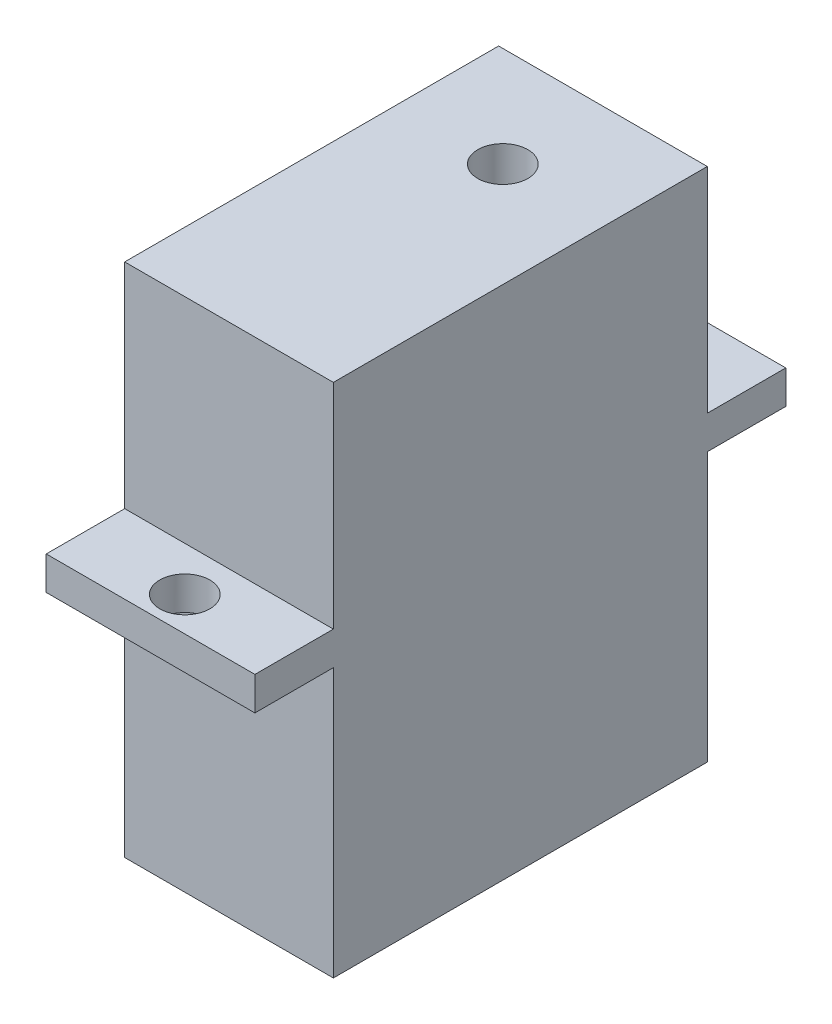
ISO-10303-21;
HEADER;
FILE_DESCRIPTION(('STEP AP214'),'2;1');
FILE_NAME('part.step','',(''),(''),'','','');
FILE_SCHEMA(('AUTOMOTIVE_DESIGN { 1 0 10303 214 1 1 1 1 }'));
ENDSEC;
DATA;
#1=APPLICATION_CONTEXT('core data for automotive mechanical design processes');
#2=APPLICATION_PROTOCOL_DEFINITION('international standard','automotive_design',2000,#1);
#3=PRODUCT_CONTEXT('',#1,'mechanical');
#4=PRODUCT('Part','Part','',(#3));
#5=PRODUCT_RELATED_PRODUCT_CATEGORY('part','',(#4));
#6=PRODUCT_DEFINITION_FORMATION('','',#4);
#7=PRODUCT_DEFINITION_CONTEXT('part definition',#1,'design');
#8=PRODUCT_DEFINITION('design','',#6,#7);
#9=PRODUCT_DEFINITION_SHAPE('','',#8);
#10=(LENGTH_UNIT() NAMED_UNIT(*) SI_UNIT(.MILLI.,.METRE.));
#11=(NAMED_UNIT(*) PLANE_ANGLE_UNIT() SI_UNIT($,.RADIAN.));
#12=(NAMED_UNIT(*) SI_UNIT($,.STERADIAN.) SOLID_ANGLE_UNIT());
#13=UNCERTAINTY_MEASURE_WITH_UNIT(LENGTH_MEASURE(1.E-05),#10,'distance_accuracy_value','');
#14=(GEOMETRIC_REPRESENTATION_CONTEXT(3) GLOBAL_UNCERTAINTY_ASSIGNED_CONTEXT((#13)) GLOBAL_UNIT_ASSIGNED_CONTEXT((#10,
#11,#12)) REPRESENTATION_CONTEXT('',''));
#15=CARTESIAN_POINT('',(0.,0.,0.));
#16=DIRECTION('',(0.,0.,1.));
#17=DIRECTION('',(1.,0.,0.));
#18=AXIS2_PLACEMENT_3D('',#15,#16,#17);
#19=CARTESIAN_POINT('',(-6.25,30.9,-11.2));
#20=DIRECTION('',(0.,0.,1.));
#21=DIRECTION('',(1.,0.,0.));
#22=AXIS2_PLACEMENT_3D('',#19,#20,#21);
#23=PLANE('',#22);
#24=DIRECTION('',(0.,-1.,0.));
#25=VECTOR('',#24,1.);
#26=CARTESIAN_POINT('',(6.25,30.9,-11.2));
#27=LINE('',#26,#25);
#28=CARTESIAN_POINT('',(6.25,30.9,-11.2));
#29=VERTEX_POINT('',#28);
#30=CARTESIAN_POINT('',(6.25,18.1,-11.2));
#31=VERTEX_POINT('',#30);
#32=EDGE_CURVE('E51',#29,#31,#27,.T.);
#33=ORIENTED_EDGE('',*,*,#32,.T.);
#34=DIRECTION('',(-1.,0.,0.));
#35=VECTOR('',#34,1.);
#36=CARTESIAN_POINT('',(-6.25,18.1,-11.2));
#37=LINE('',#36,#35);
#38=CARTESIAN_POINT('',(-6.25,18.1,-11.2));
#39=VERTEX_POINT('',#38);
#40=EDGE_CURVE('E182',#31,#39,#37,.T.);
#41=ORIENTED_EDGE('',*,*,#40,.T.);
#42=DIRECTION('',(0.,-1.,0.));
#43=VECTOR('',#42,1.);
#44=CARTESIAN_POINT('',(-6.25,30.9,-11.2));
#45=LINE('',#44,#43);
#46=CARTESIAN_POINT('',(-6.25,30.9,-11.2));
#47=VERTEX_POINT('',#46);
#48=EDGE_CURVE('E210',#47,#39,#45,.T.);
#49=ORIENTED_EDGE('',*,*,#48,.F.);
#50=DIRECTION('',(-1.,0.,0.));
#51=VECTOR('',#50,1.);
#52=CARTESIAN_POINT('',(-6.25,30.9,-11.2));
#53=LINE('',#52,#51);
#54=EDGE_CURVE('E188',#29,#47,#53,.T.);
#55=ORIENTED_EDGE('',*,*,#54,.F.);
#56=EDGE_LOOP('',(#33,#41,#49,#55));
#57=FACE_BOUND('',#56,.T.);
#58=ADVANCED_FACE('F35',(#57),#23,.F.);
#59=CARTESIAN_POINT('',(-6.25,30.9,11.2));
#60=DIRECTION('',(0.,0.,-1.));
#61=DIRECTION('',(-1.,0.,0.));
#62=AXIS2_PLACEMENT_3D('',#59,#60,#61);
#63=PLANE('',#62);
#64=DIRECTION('',(0.,-1.,0.));
#65=VECTOR('',#64,1.);
#66=CARTESIAN_POINT('',(-6.25,30.9,11.2));
#67=LINE('',#66,#65);
#68=CARTESIAN_POINT('',(-6.25,30.9,11.2));
#69=VERTEX_POINT('',#68);
#70=CARTESIAN_POINT('',(-6.25,18.1,11.2));
#71=VERTEX_POINT('',#70);
#72=EDGE_CURVE('E207',#69,#71,#67,.T.);
#73=ORIENTED_EDGE('',*,*,#72,.T.);
#74=DIRECTION('',(1.,0.,0.));
#75=VECTOR('',#74,1.);
#76=CARTESIAN_POINT('',(-6.25,18.1,11.2));
#77=LINE('',#76,#75);
#78=CARTESIAN_POINT('',(6.25,18.1,11.2));
#79=VERTEX_POINT('',#78);
#80=EDGE_CURVE('E11',#71,#79,#77,.T.);
#81=ORIENTED_EDGE('',*,*,#80,.T.);
#82=DIRECTION('',(0.,-1.,0.));
#83=VECTOR('',#82,1.);
#84=CARTESIAN_POINT('',(6.25,30.9,11.2));
#85=LINE('',#84,#83);
#86=CARTESIAN_POINT('',(6.25,30.9,11.2));
#87=VERTEX_POINT('',#86);
#88=EDGE_CURVE('E204',#87,#79,#85,.T.);
#89=ORIENTED_EDGE('',*,*,#88,.F.);
#90=DIRECTION('',(1.,0.,0.));
#91=VECTOR('',#90,1.);
#92=CARTESIAN_POINT('',(-6.25,30.9,11.2));
#93=LINE('',#92,#91);
#94=EDGE_CURVE('E193',#69,#87,#93,.T.);
#95=ORIENTED_EDGE('',*,*,#94,.F.);
#96=EDGE_LOOP('',(#73,#81,#89,#95));
#97=FACE_BOUND('',#96,.T.);
#98=ADVANCED_FACE('F229',(#97),#63,.F.);
#99=CARTESIAN_POINT('',(6.25,30.9,-11.2));
#100=DIRECTION('',(-1.,0.,0.));
#101=DIRECTION('',(0.,0.,1.));
#102=AXIS2_PLACEMENT_3D('',#99,#100,#101);
#103=PLANE('',#102);
#104=CARTESIAN_POINT('',(6.25,16.1,-11.2));
#105=VERTEX_POINT('',#104);
#106=CARTESIAN_POINT('',(6.25,0.,-11.2));
#107=VERTEX_POINT('',#106);
#108=EDGE_CURVE('E213',#105,#107,#27,.T.);
#109=ORIENTED_EDGE('',*,*,#108,.F.);
#110=DIRECTION('',(0.,0.,-1.));
#111=VECTOR('',#110,1.);
#112=CARTESIAN_POINT('',(6.25,16.1,15.9));
#113=LINE('',#112,#111);
#114=CARTESIAN_POINT('',(6.25,16.1,-15.9));
#115=VERTEX_POINT('',#114);
#116=EDGE_CURVE('E170',#105,#115,#113,.T.);
#117=ORIENTED_EDGE('',*,*,#116,.T.);
#118=DIRECTION('',(0.,1.,0.));
#119=VECTOR('',#118,1.);
#120=CARTESIAN_POINT('',(6.25,16.1,-15.9));
#121=LINE('',#120,#119);
#122=CARTESIAN_POINT('',(6.25,18.1,-15.9));
#123=VERTEX_POINT('',#122);
#124=EDGE_CURVE('E172',#115,#123,#121,.T.);
#125=ORIENTED_EDGE('',*,*,#124,.T.);
#126=DIRECTION('',(0.,0.,1.));
#127=VECTOR('',#126,1.);
#128=CARTESIAN_POINT('',(6.25,18.1,15.9));
#129=LINE('',#128,#127);
#130=EDGE_CURVE('E154',#123,#31,#129,.T.);
#131=ORIENTED_EDGE('',*,*,#130,.T.);
#132=ORIENTED_EDGE('',*,*,#32,.F.);
#133=DIRECTION('',(0.,0.,-1.));
#134=VECTOR('',#133,1.);
#135=CARTESIAN_POINT('',(6.25,30.9,-11.2));
#136=LINE('',#135,#134);
#137=EDGE_CURVE('E185',#87,#29,#136,.T.);
#138=ORIENTED_EDGE('',*,*,#137,.F.);
#139=ORIENTED_EDGE('',*,*,#88,.T.);
#140=CARTESIAN_POINT('',(6.25,18.1,15.9));
#141=VERTEX_POINT('',#140);
#142=EDGE_CURVE('E157',#79,#141,#129,.T.);
#143=ORIENTED_EDGE('',*,*,#142,.T.);
#144=DIRECTION('',(0.,-1.,0.));
#145=VECTOR('',#144,1.);
#146=CARTESIAN_POINT('',(6.25,16.1,15.9));
#147=LINE('',#146,#145);
#148=CARTESIAN_POINT('',(6.25,16.1,15.9));
#149=VERTEX_POINT('',#148);
#150=EDGE_CURVE('E168',#141,#149,#147,.T.);
#151=ORIENTED_EDGE('',*,*,#150,.T.);
#152=CARTESIAN_POINT('',(6.25,16.1,11.2));
#153=VERTEX_POINT('',#152);
#154=EDGE_CURVE('E131',#149,#153,#113,.T.);
#155=ORIENTED_EDGE('',*,*,#154,.T.);
#156=CARTESIAN_POINT('',(6.25,0.,11.2));
#157=VERTEX_POINT('',#156);
#158=EDGE_CURVE('E195',#153,#157,#85,.T.);
#159=ORIENTED_EDGE('',*,*,#158,.T.);
#160=DIRECTION('',(0.,0.,-1.));
#161=VECTOR('',#160,1.);
#162=CARTESIAN_POINT('',(6.25,0.,-11.2));
#163=LINE('',#162,#161);
#164=EDGE_CURVE('E184',#157,#107,#163,.T.);
#165=ORIENTED_EDGE('',*,*,#164,.T.);
#166=EDGE_LOOP('',(#109,#117,#125,#131,#132,#138,#139,#143,#151,#155,#159,#165));
#167=FACE_BOUND('',#166,.T.);
#168=ADVANCED_FACE('F37',(#167),#103,.F.);
#169=CARTESIAN_POINT('',(-6.25,16.1,-11.2));
#170=VERTEX_POINT('',#169);
#171=CARTESIAN_POINT('',(-6.25,0.,-11.2));
#172=VERTEX_POINT('',#171);
#173=EDGE_CURVE('E59',#170,#172,#45,.T.);
#174=ORIENTED_EDGE('',*,*,#173,.F.);
#175=DIRECTION('',(1.,0.,0.));
#176=VECTOR('',#175,1.);
#177=CARTESIAN_POINT('',(-6.25,16.1,-11.2));
#178=LINE('',#177,#176);
#179=EDGE_CURVE('E176',#170,#105,#178,.T.);
#180=ORIENTED_EDGE('',*,*,#179,.T.);
#181=ORIENTED_EDGE('',*,*,#108,.T.);
#182=DIRECTION('',(-1.,0.,0.));
#183=VECTOR('',#182,1.);
#184=CARTESIAN_POINT('',(-6.25,0.,-11.2));
#185=LINE('',#184,#183);
#186=EDGE_CURVE('E198',#107,#172,#185,.T.);
#187=ORIENTED_EDGE('',*,*,#186,.T.);
#188=EDGE_LOOP('',(#174,#180,#181,#187));
#189=FACE_BOUND('',#188,.T.);
#190=ADVANCED_FACE('F246',(#189),#23,.F.);
#191=CARTESIAN_POINT('',(-6.25,30.9,-11.2));
#192=DIRECTION('',(1.,0.,0.));
#193=DIRECTION('',(0.,0.,-1.));
#194=AXIS2_PLACEMENT_3D('',#191,#192,#193);
#195=PLANE('',#194);
#196=CARTESIAN_POINT('',(-6.25,16.1,11.2));
#197=VERTEX_POINT('',#196);
#198=CARTESIAN_POINT('',(-6.25,0.,11.2));
#199=VERTEX_POINT('',#198);
#200=EDGE_CURVE('E146',#197,#199,#67,.T.);
#201=ORIENTED_EDGE('',*,*,#200,.F.);
#202=DIRECTION('',(0.,0.,-1.));
#203=VECTOR('',#202,1.);
#204=CARTESIAN_POINT('',(-6.25,16.1,15.9));
#205=LINE('',#204,#203);
#206=CARTESIAN_POINT('',(-6.25,16.1,15.9));
#207=VERTEX_POINT('',#206);
#208=EDGE_CURVE('E129',#207,#197,#205,.T.);
#209=ORIENTED_EDGE('',*,*,#208,.F.);
#210=DIRECTION('',(0.,-1.,0.));
#211=VECTOR('',#210,1.);
#212=CARTESIAN_POINT('',(-6.25,16.1,15.9));
#213=LINE('',#212,#211);
#214=CARTESIAN_POINT('',(-6.25,18.1,15.9));
#215=VERTEX_POINT('',#214);
#216=EDGE_CURVE('E144',#215,#207,#213,.T.);
#217=ORIENTED_EDGE('',*,*,#216,.F.);
#218=DIRECTION('',(0.,0.,1.));
#219=VECTOR('',#218,1.);
#220=CARTESIAN_POINT('',(-6.25,18.1,15.9));
#221=LINE('',#220,#219);
#222=EDGE_CURVE('E165',#71,#215,#221,.T.);
#223=ORIENTED_EDGE('',*,*,#222,.F.);
#224=ORIENTED_EDGE('',*,*,#72,.F.);
#225=DIRECTION('',(0.,0.,1.));
#226=VECTOR('',#225,1.);
#227=CARTESIAN_POINT('',(-6.25,30.9,-11.2));
#228=LINE('',#227,#226);
#229=EDGE_CURVE('E191',#47,#69,#228,.T.);
#230=ORIENTED_EDGE('',*,*,#229,.F.);
#231=ORIENTED_EDGE('',*,*,#48,.T.);
#232=CARTESIAN_POINT('',(-6.25,18.1,-15.9));
#233=VERTEX_POINT('',#232);
#234=EDGE_CURVE('E137',#233,#39,#221,.T.);
#235=ORIENTED_EDGE('',*,*,#234,.F.);
#236=DIRECTION('',(0.,1.,0.));
#237=VECTOR('',#236,1.);
#238=CARTESIAN_POINT('',(-6.25,16.1,-15.9));
#239=LINE('',#238,#237);
#240=CARTESIAN_POINT('',(-6.25,16.1,-15.9));
#241=VERTEX_POINT('',#240);
#242=EDGE_CURVE('E147',#241,#233,#239,.T.);
#243=ORIENTED_EDGE('',*,*,#242,.F.);
#244=EDGE_CURVE('E148',#170,#241,#205,.T.);
#245=ORIENTED_EDGE('',*,*,#244,.F.);
#246=ORIENTED_EDGE('',*,*,#173,.T.);
#247=DIRECTION('',(0.,0.,1.));
#248=VECTOR('',#247,1.);
#249=CARTESIAN_POINT('',(-6.25,0.,-11.2));
#250=LINE('',#249,#248);
#251=EDGE_CURVE('E200',#172,#199,#250,.T.);
#252=ORIENTED_EDGE('',*,*,#251,.T.);
#253=EDGE_LOOP('',(#201,#209,#217,#223,#224,#230,#231,#235,#243,#245,#246,#252));
#254=FACE_BOUND('',#253,.T.);
#255=ADVANCED_FACE('F142',(#254),#195,.F.);
#256=ORIENTED_EDGE('',*,*,#158,.F.);
#257=DIRECTION('',(-1.,0.,0.));
#258=VECTOR('',#257,1.);
#259=CARTESIAN_POINT('',(-6.25,16.1,11.2));
#260=LINE('',#259,#258);
#261=EDGE_CURVE('E44',#153,#197,#260,.T.);
#262=ORIENTED_EDGE('',*,*,#261,.T.);
#263=ORIENTED_EDGE('',*,*,#200,.T.);
#264=DIRECTION('',(1.,0.,0.));
#265=VECTOR('',#264,1.);
#266=CARTESIAN_POINT('',(-6.25,0.,11.2));
#267=LINE('',#266,#265);
#268=EDGE_CURVE('E189',#199,#157,#267,.T.);
#269=ORIENTED_EDGE('',*,*,#268,.T.);
#270=EDGE_LOOP('',(#256,#262,#263,#269));
#271=FACE_BOUND('',#270,.T.);
#272=ADVANCED_FACE('F217',(#271),#63,.F.);
#273=CARTESIAN_POINT('',(0.,30.9,0.));
#274=DIRECTION('',(0.,1.,0.));
#275=DIRECTION('',(0.,0.,1.));
#276=AXIS2_PLACEMENT_3D('',#273,#274,#275);
#277=PLANE('',#276);
#278=CARTESIAN_POINT('',(0.,30.9,-5.2));
#279=DIRECTION('',(0.,1.,0.));
#280=DIRECTION('',(0.,0.,1.));
#281=AXIS2_PLACEMENT_3D('',#278,#279,#280);
#282=CIRCLE('',#281,1.5);
#283=CARTESIAN_POINT('',(0.,30.9,-3.7));
#284=VERTEX_POINT('',#283);
#285=EDGE_CURVE('E412',#284,#284,#282,.T.);
#286=ORIENTED_EDGE('',*,*,#285,.F.);
#287=EDGE_LOOP('',(#286));
#288=FACE_BOUND('',#287,.T.);
#289=ORIENTED_EDGE('',*,*,#137,.T.);
#290=ORIENTED_EDGE('',*,*,#54,.T.);
#291=ORIENTED_EDGE('',*,*,#229,.T.);
#292=ORIENTED_EDGE('',*,*,#94,.T.);
#293=EDGE_LOOP('',(#289,#290,#291,#292));
#294=FACE_BOUND('',#293,.T.);
#295=ADVANCED_FACE('F231',(#288,#294),#277,.T.);
#296=CARTESIAN_POINT('',(0.,0.,0.));
#297=DIRECTION('',(0.,1.,0.));
#298=DIRECTION('',(0.,0.,1.));
#299=AXIS2_PLACEMENT_3D('',#296,#297,#298);
#300=PLANE('',#299);
#301=ORIENTED_EDGE('',*,*,#164,.F.);
#302=ORIENTED_EDGE('',*,*,#268,.F.);
#303=ORIENTED_EDGE('',*,*,#251,.F.);
#304=ORIENTED_EDGE('',*,*,#186,.F.);
#305=EDGE_LOOP('',(#301,#302,#303,#304));
#306=FACE_BOUND('',#305,.T.);
#307=ADVANCED_FACE('F250',(#306),#300,.F.);
#308=CARTESIAN_POINT('',(-6.25,16.1,15.9));
#309=DIRECTION('',(0.,0.,1.));
#310=DIRECTION('',(0.,-1.,0.));
#311=AXIS2_PLACEMENT_3D('',#308,#309,#310);
#312=PLANE('',#311);
#313=ORIENTED_EDGE('',*,*,#150,.F.);
#314=DIRECTION('',(1.,0.,0.));
#315=VECTOR('',#314,1.);
#316=CARTESIAN_POINT('',(-6.25,18.1,15.9));
#317=LINE('',#316,#315);
#318=EDGE_CURVE('E153',#215,#141,#317,.T.);
#319=ORIENTED_EDGE('',*,*,#318,.F.);
#320=ORIENTED_EDGE('',*,*,#216,.T.);
#321=DIRECTION('',(1.,0.,0.));
#322=VECTOR('',#321,1.);
#323=CARTESIAN_POINT('',(-6.25,16.1,15.9));
#324=LINE('',#323,#322);
#325=EDGE_CURVE('E125',#207,#149,#324,.T.);
#326=ORIENTED_EDGE('',*,*,#325,.T.);
#327=EDGE_LOOP('',(#313,#319,#320,#326));
#328=FACE_BOUND('',#327,.T.);
#329=ADVANCED_FACE('F151',(#328),#312,.T.);
#330=CARTESIAN_POINT('',(-6.25,16.1,15.9));
#331=DIRECTION('',(0.,-1.,0.));
#332=DIRECTION('',(0.,0.,-1.));
#333=AXIS2_PLACEMENT_3D('',#330,#331,#332);
#334=PLANE('',#333);
#335=CARTESIAN_POINT('',(0.,16.1,13.85));
#336=DIRECTION('',(0.,-1.,0.));
#337=DIRECTION('',(0.,0.,-1.));
#338=AXIS2_PLACEMENT_3D('',#335,#336,#337);
#339=CIRCLE('',#338,1.5);
#340=CARTESIAN_POINT('',(0.,16.1,12.35));
#341=VERTEX_POINT('',#340);
#342=EDGE_CURVE('E160',#341,#341,#339,.T.);
#343=ORIENTED_EDGE('',*,*,#342,.F.);
#344=EDGE_LOOP('',(#343));
#345=FACE_BOUND('',#344,.T.);
#346=ORIENTED_EDGE('',*,*,#261,.F.);
#347=ORIENTED_EDGE('',*,*,#154,.F.);
#348=ORIENTED_EDGE('',*,*,#325,.F.);
#349=ORIENTED_EDGE('',*,*,#208,.T.);
#350=EDGE_LOOP('',(#346,#347,#348,#349));
#351=FACE_BOUND('',#350,.T.);
#352=ADVANCED_FACE('F128',(#345,#351),#334,.T.);
#353=CARTESIAN_POINT('',(-6.25,18.1,15.9));
#354=DIRECTION('',(0.,1.,0.));
#355=DIRECTION('',(0.,0.,1.));
#356=AXIS2_PLACEMENT_3D('',#353,#354,#355);
#357=PLANE('',#356);
#358=CARTESIAN_POINT('',(0.,18.1,13.85));
#359=DIRECTION('',(0.,1.,0.));
#360=DIRECTION('',(0.,0.,1.));
#361=AXIS2_PLACEMENT_3D('',#358,#359,#360);
#362=CIRCLE('',#361,1.5);
#363=CARTESIAN_POINT('',(0.,18.1,15.35));
#364=VERTEX_POINT('',#363);
#365=EDGE_CURVE('E411',#364,#364,#362,.T.);
#366=ORIENTED_EDGE('',*,*,#365,.F.);
#367=EDGE_LOOP('',(#366));
#368=FACE_BOUND('',#367,.T.);
#369=ORIENTED_EDGE('',*,*,#80,.F.);
#370=ORIENTED_EDGE('',*,*,#222,.T.);
#371=ORIENTED_EDGE('',*,*,#318,.T.);
#372=ORIENTED_EDGE('',*,*,#142,.F.);
#373=EDGE_LOOP('',(#369,#370,#371,#372));
#374=FACE_BOUND('',#373,.T.);
#375=ADVANCED_FACE('F224',(#368,#374),#357,.T.);
#376=CARTESIAN_POINT('',(0.,18.1,-13.85));
#377=DIRECTION('',(0.,1.,0.));
#378=DIRECTION('',(0.,0.,1.));
#379=AXIS2_PLACEMENT_3D('',#376,#377,#378);
#380=CIRCLE('',#379,1.5);
#381=CARTESIAN_POINT('',(0.,18.1,-12.35));
#382=VERTEX_POINT('',#381);
#383=EDGE_CURVE('E415',#382,#382,#380,.T.);
#384=ORIENTED_EDGE('',*,*,#383,.F.);
#385=EDGE_LOOP('',(#384));
#386=FACE_BOUND('',#385,.T.);
#387=ORIENTED_EDGE('',*,*,#40,.F.);
#388=ORIENTED_EDGE('',*,*,#130,.F.);
#389=DIRECTION('',(1.,0.,0.));
#390=VECTOR('',#389,1.);
#391=CARTESIAN_POINT('',(-6.25,18.1,-15.9));
#392=LINE('',#391,#390);
#393=EDGE_CURVE('E177',#233,#123,#392,.T.);
#394=ORIENTED_EDGE('',*,*,#393,.F.);
#395=ORIENTED_EDGE('',*,*,#234,.T.);
#396=EDGE_LOOP('',(#387,#388,#394,#395));
#397=FACE_BOUND('',#396,.T.);
#398=ADVANCED_FACE('F236',(#386,#397),#357,.T.);
#399=CARTESIAN_POINT('',(0.,16.1,-13.85));
#400=DIRECTION('',(0.,-1.,0.));
#401=DIRECTION('',(0.,0.,-1.));
#402=AXIS2_PLACEMENT_3D('',#399,#400,#401);
#403=CIRCLE('',#402,1.5);
#404=CARTESIAN_POINT('',(0.,16.1,-15.35));
#405=VERTEX_POINT('',#404);
#406=EDGE_CURVE('E39',#405,#405,#403,.T.);
#407=ORIENTED_EDGE('',*,*,#406,.F.);
#408=EDGE_LOOP('',(#407));
#409=FACE_BOUND('',#408,.T.);
#410=ORIENTED_EDGE('',*,*,#179,.F.);
#411=ORIENTED_EDGE('',*,*,#244,.T.);
#412=DIRECTION('',(1.,0.,0.));
#413=VECTOR('',#412,1.);
#414=CARTESIAN_POINT('',(-6.25,16.1,-15.9));
#415=LINE('',#414,#413);
#416=EDGE_CURVE('E136',#241,#115,#415,.T.);
#417=ORIENTED_EDGE('',*,*,#416,.T.);
#418=ORIENTED_EDGE('',*,*,#116,.F.);
#419=EDGE_LOOP('',(#410,#411,#417,#418));
#420=FACE_BOUND('',#419,.T.);
#421=ADVANCED_FACE('F244',(#409,#420),#334,.T.);
#422=CARTESIAN_POINT('',(-6.25,16.1,-15.9));
#423=DIRECTION('',(0.,0.,-1.));
#424=DIRECTION('',(0.,1.,0.));
#425=AXIS2_PLACEMENT_3D('',#422,#423,#424);
#426=PLANE('',#425);
#427=ORIENTED_EDGE('',*,*,#124,.F.);
#428=ORIENTED_EDGE('',*,*,#416,.F.);
#429=ORIENTED_EDGE('',*,*,#242,.T.);
#430=ORIENTED_EDGE('',*,*,#393,.T.);
#431=EDGE_LOOP('',(#427,#428,#429,#430));
#432=FACE_BOUND('',#431,.T.);
#433=ADVANCED_FACE('F241',(#432),#426,.T.);
#434=CARTESIAN_POINT('',(0.,0.,-13.85));
#435=DIRECTION('',(0.,1.,0.));
#436=DIRECTION('',(0.,0.,1.));
#437=AXIS2_PLACEMENT_3D('',#434,#435,#436);
#438=CYLINDRICAL_SURFACE('',#437,1.5);
#439=ORIENTED_EDGE('',*,*,#406,.T.);
#440=EDGE_LOOP('',(#439));
#441=FACE_BOUND('',#440,.T.);
#442=ORIENTED_EDGE('',*,*,#383,.T.);
#443=EDGE_LOOP('',(#442));
#444=FACE_BOUND('',#443,.T.);
#445=ADVANCED_FACE('F364',(#441,#444),#438,.F.);
#446=CARTESIAN_POINT('',(0.,0.,13.85));
#447=DIRECTION('',(0.,1.,0.));
#448=DIRECTION('',(0.,0.,1.));
#449=AXIS2_PLACEMENT_3D('',#446,#447,#448);
#450=CYLINDRICAL_SURFACE('',#449,1.5);
#451=ORIENTED_EDGE('',*,*,#342,.T.);
#452=EDGE_LOOP('',(#451));
#453=FACE_BOUND('',#452,.T.);
#454=ORIENTED_EDGE('',*,*,#365,.T.);
#455=EDGE_LOOP('',(#454));
#456=FACE_BOUND('',#455,.T.);
#457=ADVANCED_FACE('F371',(#453,#456),#450,.F.);
#458=CARTESIAN_POINT('',(0.,27.9,-5.2));
#459=DIRECTION('',(0.,1.,0.));
#460=DIRECTION('',(0.,0.,1.));
#461=AXIS2_PLACEMENT_3D('',#458,#459,#460);
#462=CYLINDRICAL_SURFACE('',#461,1.5);
#463=CARTESIAN_POINT('',(0.,27.9,-5.2));
#464=DIRECTION('',(0.,1.,0.));
#465=DIRECTION('',(0.,0.,1.));
#466=AXIS2_PLACEMENT_3D('',#463,#464,#465);
#467=CIRCLE('',#466,1.5);
#468=CARTESIAN_POINT('',(0.,27.9,-3.7));
#469=VERTEX_POINT('',#468);
#470=EDGE_CURVE('E410',#469,#469,#467,.T.);
#471=ORIENTED_EDGE('',*,*,#470,.F.);
#472=EDGE_LOOP('',(#471));
#473=FACE_BOUND('',#472,.T.);
#474=ORIENTED_EDGE('',*,*,#285,.T.);
#475=EDGE_LOOP('',(#474));
#476=FACE_BOUND('',#475,.T.);
#477=ADVANCED_FACE('F379',(#473,#476),#462,.F.);
#478=CARTESIAN_POINT('',(0.,27.9,-5.2));
#479=DIRECTION('',(0.,1.,0.));
#480=DIRECTION('',(0.,0.,1.));
#481=AXIS2_PLACEMENT_3D('',#478,#479,#480);
#482=PLANE('',#481);
#483=ORIENTED_EDGE('',*,*,#470,.T.);
#484=EDGE_LOOP('',(#483));
#485=FACE_BOUND('',#484,.T.);
#486=ADVANCED_FACE('F387',(#485),#482,.T.);
#487=CLOSED_SHELL('',(#58,#98,#168,#190,#255,#272,#295,#307,#329,#352,#375,#398,#421,#433,#445,
#457,#477,#486));
#488=MANIFOLD_SOLID_BREP('B2',#487);
#489=ADVANCED_BREP_SHAPE_REPRESENTATION('',(#18,#488),#14);
#490=SHAPE_DEFINITION_REPRESENTATION(#9,#489);
ENDSEC;
END-ISO-10303-21;
